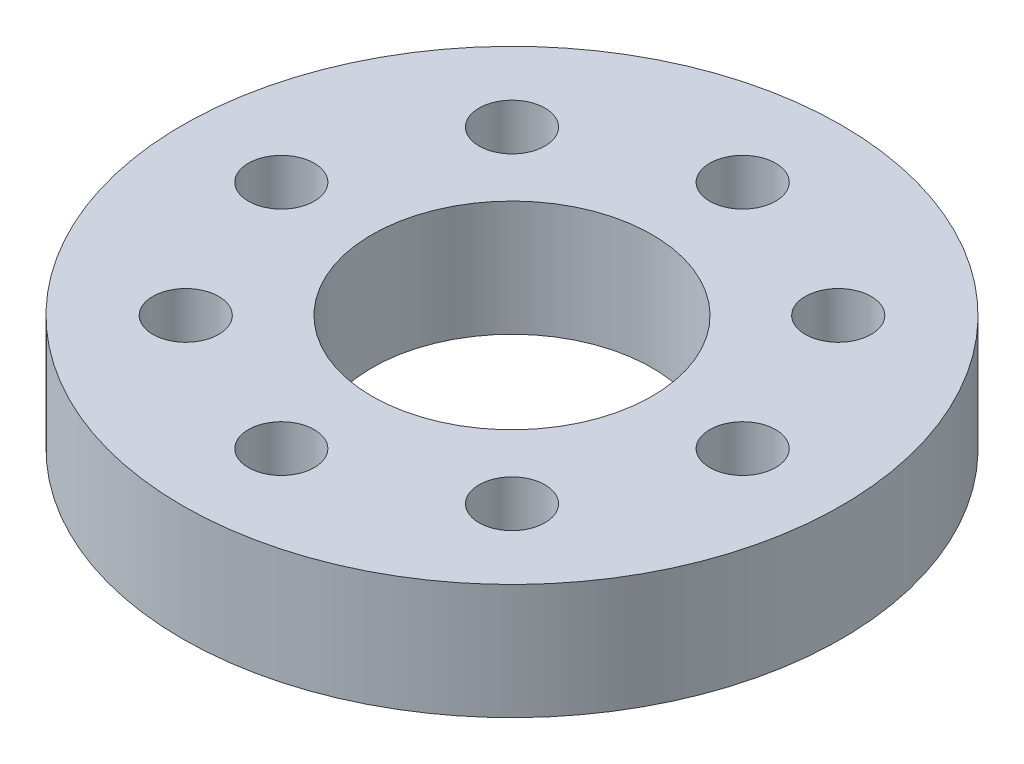
ISO-10303-21;
HEADER;
FILE_DESCRIPTION(('STEP AP214'),'2;1');
FILE_NAME('part.step','',(''),(''),'','','');
FILE_SCHEMA(('AUTOMOTIVE_DESIGN { 1 0 10303 214 1 1 1 1 }'));
ENDSEC;
DATA;
#1=APPLICATION_CONTEXT('core data for automotive mechanical design processes');
#2=APPLICATION_PROTOCOL_DEFINITION('international standard','automotive_design',2000,#1);
#3=PRODUCT_CONTEXT('',#1,'mechanical');
#4=PRODUCT('Part','Part','',(#3));
#5=PRODUCT_RELATED_PRODUCT_CATEGORY('part','',(#4));
#6=PRODUCT_DEFINITION_FORMATION('','',#4);
#7=PRODUCT_DEFINITION_CONTEXT('part definition',#1,'design');
#8=PRODUCT_DEFINITION('design','',#6,#7);
#9=PRODUCT_DEFINITION_SHAPE('','',#8);
#10=(LENGTH_UNIT() NAMED_UNIT(*) SI_UNIT(.MILLI.,.METRE.));
#11=(NAMED_UNIT(*) PLANE_ANGLE_UNIT() SI_UNIT($,.RADIAN.));
#12=(NAMED_UNIT(*) SI_UNIT($,.STERADIAN.) SOLID_ANGLE_UNIT());
#13=UNCERTAINTY_MEASURE_WITH_UNIT(LENGTH_MEASURE(1.E-05),#10,'distance_accuracy_value','');
#14=(GEOMETRIC_REPRESENTATION_CONTEXT(3) GLOBAL_UNCERTAINTY_ASSIGNED_CONTEXT((#13)) GLOBAL_UNIT_ASSIGNED_CONTEXT((#10,
#11,#12)) REPRESENTATION_CONTEXT('',''));
#15=CARTESIAN_POINT('',(0.,0.,0.));
#16=DIRECTION('',(0.,0.,1.));
#17=DIRECTION('',(1.,0.,0.));
#18=AXIS2_PLACEMENT_3D('',#15,#16,#17);
#19=CARTESIAN_POINT('',(0.,3.5,0.));
#20=DIRECTION('',(0.,1.,0.));
#21=DIRECTION('',(0.,0.,1.));
#22=AXIS2_PLACEMENT_3D('',#19,#20,#21);
#23=PLANE('',#22);
#24=CARTESIAN_POINT('',(-6.9999999999994,3.5,5.96855898038484E-13));
#25=DIRECTION('',(0.,1.,0.));
#26=DIRECTION('',(0.,0.,1.));
#27=AXIS2_PLACEMENT_3D('',#24,#25,#26);
#28=CIRCLE('',#27,1.00000000000081);
#29=CARTESIAN_POINT('',(-6.9999999999994,3.5,1.00000000000141));
#30=VERTEX_POINT('',#29);
#31=EDGE_CURVE('E104',#30,#30,#28,.T.);
#32=ORIENTED_EDGE('',*,*,#31,.F.);
#33=EDGE_LOOP('',(#32));
#34=FACE_BOUND('',#33,.T.);
#35=CARTESIAN_POINT('',(1.19170105948276E-12,3.5,7.));
#36=DIRECTION('',(0.,1.,0.));
#37=DIRECTION('',(0.,0.,1.));
#38=AXIS2_PLACEMENT_3D('',#35,#36,#37);
#39=CIRCLE('',#38,1.00000000000119);
#40=CARTESIAN_POINT('',(1.19170105948276E-12,3.5,8.00000000000119));
#41=VERTEX_POINT('',#40);
#42=EDGE_CURVE('E88',#41,#41,#39,.T.);
#43=ORIENTED_EDGE('',*,*,#42,.F.);
#44=EDGE_LOOP('',(#43));
#45=FACE_BOUND('',#44,.T.);
#46=CARTESIAN_POINT('',(7.0000000000006,3.5,-5.95998645279081E-13));
#47=DIRECTION('',(0.,1.,0.));
#48=DIRECTION('',(0.,0.,1.));
#49=AXIS2_PLACEMENT_3D('',#46,#47,#48);
#50=CIRCLE('',#49,1.00000000000042);
#51=CARTESIAN_POINT('',(7.0000000000006,3.5,0.999999999999823));
#52=VERTEX_POINT('',#51);
#53=EDGE_CURVE('E72',#52,#52,#50,.T.);
#54=ORIENTED_EDGE('',*,*,#53,.F.);
#55=EDGE_LOOP('',(#54));
#56=FACE_BOUND('',#55,.T.);
#57=CARTESIAN_POINT('',(0.,3.5,-7.));
#58=DIRECTION('',(0.,1.,0.));
#59=DIRECTION('',(0.,0.,1.));
#60=AXIS2_PLACEMENT_3D('',#57,#58,#59);
#61=CIRCLE('',#60,1.);
#62=CARTESIAN_POINT('',(0.,3.5,-6.));
#63=VERTEX_POINT('',#62);
#64=EDGE_CURVE('E56',#63,#63,#61,.T.);
#65=ORIENTED_EDGE('',*,*,#64,.F.);
#66=EDGE_LOOP('',(#65));
#67=FACE_BOUND('',#66,.T.);
#68=CARTESIAN_POINT('',(0.,3.5,0.));
#69=DIRECTION('',(0.,1.,0.));
#70=DIRECTION('',(0.,0.,1.));
#71=AXIS2_PLACEMENT_3D('',#68,#69,#70);
#72=CIRCLE('',#71,10.);
#73=CARTESIAN_POINT('',(0.,3.5,10.));
#74=VERTEX_POINT('',#73);
#75=EDGE_CURVE('E10',#74,#74,#72,.T.);
#76=ORIENTED_EDGE('',*,*,#75,.T.);
#77=EDGE_LOOP('',(#76));
#78=FACE_BOUND('',#77,.T.);
#79=CARTESIAN_POINT('',(0.,3.5,0.));
#80=DIRECTION('',(0.,1.,0.));
#81=DIRECTION('',(0.,0.,1.));
#82=AXIS2_PLACEMENT_3D('',#79,#80,#81);
#83=CIRCLE('',#82,4.25);
#84=CARTESIAN_POINT('',(0.,3.5,4.25));
#85=VERTEX_POINT('',#84);
#86=EDGE_CURVE('E50',#85,#85,#83,.T.);
#87=ORIENTED_EDGE('',*,*,#86,.F.);
#88=EDGE_LOOP('',(#87));
#89=FACE_BOUND('',#88,.T.);
#90=CARTESIAN_POINT('',(4.94974746830601,3.5,-4.94974746830625));
#91=DIRECTION('',(0.,1.,0.));
#92=DIRECTION('',(0.,0.,1.));
#93=AXIS2_PLACEMENT_3D('',#90,#91,#92);
#94=CIRCLE('',#93,1.00000000000006);
#95=CARTESIAN_POINT('',(4.94974746830601,3.5,-3.9497474683062));
#96=VERTEX_POINT('',#95);
#97=EDGE_CURVE('E64',#96,#96,#94,.T.);
#98=ORIENTED_EDGE('',*,*,#97,.F.);
#99=EDGE_LOOP('',(#98));
#100=FACE_BOUND('',#99,.T.);
#101=CARTESIAN_POINT('',(4.94974746830685,3.5,4.94974746830541));
#102=DIRECTION('',(0.,1.,0.));
#103=DIRECTION('',(0.,0.,1.));
#104=AXIS2_PLACEMENT_3D('',#101,#102,#103);
#105=CIRCLE('',#104,1.00000000000088);
#106=CARTESIAN_POINT('',(4.94974746830685,3.5,5.94974746830629));
#107=VERTEX_POINT('',#106);
#108=EDGE_CURVE('E80',#107,#107,#105,.T.);
#109=ORIENTED_EDGE('',*,*,#108,.F.);
#110=EDGE_LOOP('',(#109));
#111=FACE_BOUND('',#110,.T.);
#112=CARTESIAN_POINT('',(-4.94974746830482,3.5,4.94974746830625));
#113=DIRECTION('',(0.,1.,0.));
#114=DIRECTION('',(0.,0.,1.));
#115=AXIS2_PLACEMENT_3D('',#112,#113,#114);
#116=CIRCLE('',#115,1.00000000000116);
#117=CARTESIAN_POINT('',(-4.94974746830482,3.5,5.94974746830741));
#118=VERTEX_POINT('',#117);
#119=EDGE_CURVE('E96',#118,#118,#116,.T.);
#120=ORIENTED_EDGE('',*,*,#119,.F.);
#121=EDGE_LOOP('',(#120));
#122=FACE_BOUND('',#121,.T.);
#123=CARTESIAN_POINT('',(-4.94974746830566,3.5,-4.94974746830541));
#124=DIRECTION('',(0.,1.,0.));
#125=DIRECTION('',(0.,0.,1.));
#126=AXIS2_PLACEMENT_3D('',#123,#124,#125);
#127=CIRCLE('',#126,1.00000000000037);
#128=CARTESIAN_POINT('',(-4.94974746830566,3.5,-3.94974746830504));
#129=VERTEX_POINT('',#128);
#130=EDGE_CURVE('E112',#129,#129,#127,.T.);
#131=ORIENTED_EDGE('',*,*,#130,.F.);
#132=EDGE_LOOP('',(#131));
#133=FACE_BOUND('',#132,.T.);
#134=ADVANCED_FACE('F37',(#34,#45,#56,#67,#78,#89,#100,#111,#122,#133),#23,.T.);
#135=CARTESIAN_POINT('',(0.,0.,0.));
#136=DIRECTION('',(0.,1.,0.));
#137=DIRECTION('',(0.,0.,1.));
#138=AXIS2_PLACEMENT_3D('',#135,#136,#137);
#139=PLANE('',#138);
#140=CARTESIAN_POINT('',(0.,0.,0.));
#141=DIRECTION('',(0.,1.,0.));
#142=DIRECTION('',(0.,0.,1.));
#143=AXIS2_PLACEMENT_3D('',#140,#141,#142);
#144=CIRCLE('',#143,10.);
#145=CARTESIAN_POINT('',(0.,0.,10.));
#146=VERTEX_POINT('',#145);
#147=EDGE_CURVE('E41',#146,#146,#144,.T.);
#148=ORIENTED_EDGE('',*,*,#147,.F.);
#149=EDGE_LOOP('',(#148));
#150=FACE_BOUND('',#149,.T.);
#151=CARTESIAN_POINT('',(0.,0.,0.));
#152=DIRECTION('',(0.,1.,0.));
#153=DIRECTION('',(0.,0.,1.));
#154=AXIS2_PLACEMENT_3D('',#151,#152,#153);
#155=CIRCLE('',#154,4.25);
#156=CARTESIAN_POINT('',(0.,0.,4.25));
#157=VERTEX_POINT('',#156);
#158=EDGE_CURVE('E52',#157,#157,#155,.T.);
#159=ORIENTED_EDGE('',*,*,#158,.T.);
#160=EDGE_LOOP('',(#159));
#161=FACE_BOUND('',#160,.T.);
#162=CARTESIAN_POINT('',(0.,0.,-7.));
#163=DIRECTION('',(0.,1.,0.));
#164=DIRECTION('',(0.,0.,1.));
#165=AXIS2_PLACEMENT_3D('',#162,#163,#164);
#166=CIRCLE('',#165,1.);
#167=CARTESIAN_POINT('',(0.,0.,-6.));
#168=VERTEX_POINT('',#167);
#169=EDGE_CURVE('E60',#168,#168,#166,.T.);
#170=ORIENTED_EDGE('',*,*,#169,.T.);
#171=EDGE_LOOP('',(#170));
#172=FACE_BOUND('',#171,.T.);
#173=CARTESIAN_POINT('',(4.94974746830601,0.,-4.94974746830625));
#174=DIRECTION('',(0.,1.,0.));
#175=DIRECTION('',(0.,0.,1.));
#176=AXIS2_PLACEMENT_3D('',#173,#174,#175);
#177=CIRCLE('',#176,1.00000000000006);
#178=CARTESIAN_POINT('',(4.94974746830601,0.,-3.9497474683062));
#179=VERTEX_POINT('',#178);
#180=EDGE_CURVE('E68',#179,#179,#177,.T.);
#181=ORIENTED_EDGE('',*,*,#180,.T.);
#182=EDGE_LOOP('',(#181));
#183=FACE_BOUND('',#182,.T.);
#184=CARTESIAN_POINT('',(7.0000000000006,0.,-5.95998645279081E-13));
#185=DIRECTION('',(0.,1.,0.));
#186=DIRECTION('',(0.,0.,1.));
#187=AXIS2_PLACEMENT_3D('',#184,#185,#186);
#188=CIRCLE('',#187,1.00000000000042);
#189=CARTESIAN_POINT('',(7.0000000000006,0.,0.999999999999823));
#190=VERTEX_POINT('',#189);
#191=EDGE_CURVE('E76',#190,#190,#188,.T.);
#192=ORIENTED_EDGE('',*,*,#191,.T.);
#193=EDGE_LOOP('',(#192));
#194=FACE_BOUND('',#193,.T.);
#195=CARTESIAN_POINT('',(4.94974746830685,0.,4.94974746830541));
#196=DIRECTION('',(0.,1.,0.));
#197=DIRECTION('',(0.,0.,1.));
#198=AXIS2_PLACEMENT_3D('',#195,#196,#197);
#199=CIRCLE('',#198,1.00000000000088);
#200=CARTESIAN_POINT('',(4.94974746830685,0.,5.94974746830629));
#201=VERTEX_POINT('',#200);
#202=EDGE_CURVE('E84',#201,#201,#199,.T.);
#203=ORIENTED_EDGE('',*,*,#202,.T.);
#204=EDGE_LOOP('',(#203));
#205=FACE_BOUND('',#204,.T.);
#206=CARTESIAN_POINT('',(1.19170105948276E-12,0.,7.));
#207=DIRECTION('',(0.,1.,0.));
#208=DIRECTION('',(0.,0.,1.));
#209=AXIS2_PLACEMENT_3D('',#206,#207,#208);
#210=CIRCLE('',#209,1.00000000000119);
#211=CARTESIAN_POINT('',(1.19170105948276E-12,0.,8.00000000000119));
#212=VERTEX_POINT('',#211);
#213=EDGE_CURVE('E92',#212,#212,#210,.T.);
#214=ORIENTED_EDGE('',*,*,#213,.T.);
#215=EDGE_LOOP('',(#214));
#216=FACE_BOUND('',#215,.T.);
#217=CARTESIAN_POINT('',(-4.94974746830482,0.,4.94974746830625));
#218=DIRECTION('',(0.,1.,0.));
#219=DIRECTION('',(0.,0.,1.));
#220=AXIS2_PLACEMENT_3D('',#217,#218,#219);
#221=CIRCLE('',#220,1.00000000000116);
#222=CARTESIAN_POINT('',(-4.94974746830482,0.,5.94974746830741));
#223=VERTEX_POINT('',#222);
#224=EDGE_CURVE('E100',#223,#223,#221,.T.);
#225=ORIENTED_EDGE('',*,*,#224,.T.);
#226=EDGE_LOOP('',(#225));
#227=FACE_BOUND('',#226,.T.);
#228=CARTESIAN_POINT('',(-6.9999999999994,0.,5.96855898038484E-13));
#229=DIRECTION('',(0.,1.,0.));
#230=DIRECTION('',(0.,0.,1.));
#231=AXIS2_PLACEMENT_3D('',#228,#229,#230);
#232=CIRCLE('',#231,1.00000000000081);
#233=CARTESIAN_POINT('',(-6.9999999999994,0.,1.00000000000141));
#234=VERTEX_POINT('',#233);
#235=EDGE_CURVE('E108',#234,#234,#232,.T.);
#236=ORIENTED_EDGE('',*,*,#235,.T.);
#237=EDGE_LOOP('',(#236));
#238=FACE_BOUND('',#237,.T.);
#239=CARTESIAN_POINT('',(-4.94974746830566,0.,-4.94974746830541));
#240=DIRECTION('',(0.,1.,0.));
#241=DIRECTION('',(0.,0.,1.));
#242=AXIS2_PLACEMENT_3D('',#239,#240,#241);
#243=CIRCLE('',#242,1.00000000000037);
#244=CARTESIAN_POINT('',(-4.94974746830566,0.,-3.94974746830504));
#245=VERTEX_POINT('',#244);
#246=EDGE_CURVE('E116',#245,#245,#243,.T.);
#247=ORIENTED_EDGE('',*,*,#246,.T.);
#248=EDGE_LOOP('',(#247));
#249=FACE_BOUND('',#248,.T.);
#250=ADVANCED_FACE('F128',(#150,#161,#172,#183,#194,#205,#216,#227,#238,#249),#139,.F.);
#251=CARTESIAN_POINT('',(0.,3.5,0.));
#252=DIRECTION('',(0.,-1.,0.));
#253=DIRECTION('',(0.,0.,-1.));
#254=AXIS2_PLACEMENT_3D('',#251,#252,#253);
#255=CYLINDRICAL_SURFACE('',#254,10.);
#256=ORIENTED_EDGE('',*,*,#75,.F.);
#257=EDGE_LOOP('',(#256));
#258=FACE_BOUND('',#257,.T.);
#259=ORIENTED_EDGE('',*,*,#147,.T.);
#260=EDGE_LOOP('',(#259));
#261=FACE_BOUND('',#260,.T.);
#262=ADVANCED_FACE('F39',(#258,#261),#255,.T.);
#263=CARTESIAN_POINT('',(0.,3.5,0.));
#264=DIRECTION('',(0.,-1.,0.));
#265=DIRECTION('',(0.,0.,-1.));
#266=AXIS2_PLACEMENT_3D('',#263,#264,#265);
#267=CYLINDRICAL_SURFACE('',#266,4.25);
#268=ORIENTED_EDGE('',*,*,#86,.T.);
#269=EDGE_LOOP('',(#268));
#270=FACE_BOUND('',#269,.T.);
#271=ORIENTED_EDGE('',*,*,#158,.F.);
#272=EDGE_LOOP('',(#271));
#273=FACE_BOUND('',#272,.T.);
#274=ADVANCED_FACE('F138',(#270,#273),#267,.F.);
#275=CARTESIAN_POINT('',(0.,3.5,-7.));
#276=DIRECTION('',(0.,-1.,0.));
#277=DIRECTION('',(0.,0.,-1.));
#278=AXIS2_PLACEMENT_3D('',#275,#276,#277);
#279=CYLINDRICAL_SURFACE('',#278,1.);
#280=ORIENTED_EDGE('',*,*,#64,.T.);
#281=EDGE_LOOP('',(#280));
#282=FACE_BOUND('',#281,.T.);
#283=ORIENTED_EDGE('',*,*,#169,.F.);
#284=EDGE_LOOP('',(#283));
#285=FACE_BOUND('',#284,.T.);
#286=ADVANCED_FACE('F141',(#282,#285),#279,.F.);
#287=CARTESIAN_POINT('',(4.94974746830601,3.5,-4.94974746830625));
#288=DIRECTION('',(0.,-1.,0.));
#289=DIRECTION('',(0.,0.,-1.));
#290=AXIS2_PLACEMENT_3D('',#287,#288,#289);
#291=CYLINDRICAL_SURFACE('',#290,1.00000000000006);
#292=ORIENTED_EDGE('',*,*,#97,.T.);
#293=EDGE_LOOP('',(#292));
#294=FACE_BOUND('',#293,.T.);
#295=ORIENTED_EDGE('',*,*,#180,.F.);
#296=EDGE_LOOP('',(#295));
#297=FACE_BOUND('',#296,.T.);
#298=ADVANCED_FACE('F145',(#294,#297),#291,.F.);
#299=CARTESIAN_POINT('',(7.0000000000006,3.5,-5.95998645279081E-13));
#300=DIRECTION('',(0.,-1.,0.));
#301=DIRECTION('',(0.,0.,-1.));
#302=AXIS2_PLACEMENT_3D('',#299,#300,#301);
#303=CYLINDRICAL_SURFACE('',#302,1.00000000000042);
#304=ORIENTED_EDGE('',*,*,#53,.T.);
#305=EDGE_LOOP('',(#304));
#306=FACE_BOUND('',#305,.T.);
#307=ORIENTED_EDGE('',*,*,#191,.F.);
#308=EDGE_LOOP('',(#307));
#309=FACE_BOUND('',#308,.T.);
#310=ADVANCED_FACE('F149',(#306,#309),#303,.F.);
#311=CARTESIAN_POINT('',(4.94974746830685,3.5,4.94974746830541));
#312=DIRECTION('',(0.,-1.,0.));
#313=DIRECTION('',(0.,0.,-1.));
#314=AXIS2_PLACEMENT_3D('',#311,#312,#313);
#315=CYLINDRICAL_SURFACE('',#314,1.00000000000088);
#316=ORIENTED_EDGE('',*,*,#108,.T.);
#317=EDGE_LOOP('',(#316));
#318=FACE_BOUND('',#317,.T.);
#319=ORIENTED_EDGE('',*,*,#202,.F.);
#320=EDGE_LOOP('',(#319));
#321=FACE_BOUND('',#320,.T.);
#322=ADVANCED_FACE('F153',(#318,#321),#315,.F.);
#323=CARTESIAN_POINT('',(1.19170105948276E-12,3.5,7.));
#324=DIRECTION('',(0.,-1.,0.));
#325=DIRECTION('',(0.,0.,-1.));
#326=AXIS2_PLACEMENT_3D('',#323,#324,#325);
#327=CYLINDRICAL_SURFACE('',#326,1.00000000000119);
#328=ORIENTED_EDGE('',*,*,#42,.T.);
#329=EDGE_LOOP('',(#328));
#330=FACE_BOUND('',#329,.T.);
#331=ORIENTED_EDGE('',*,*,#213,.F.);
#332=EDGE_LOOP('',(#331));
#333=FACE_BOUND('',#332,.T.);
#334=ADVANCED_FACE('F157',(#330,#333),#327,.F.);
#335=CARTESIAN_POINT('',(-4.94974746830482,3.5,4.94974746830625));
#336=DIRECTION('',(0.,-1.,0.));
#337=DIRECTION('',(0.,0.,-1.));
#338=AXIS2_PLACEMENT_3D('',#335,#336,#337);
#339=CYLINDRICAL_SURFACE('',#338,1.00000000000116);
#340=ORIENTED_EDGE('',*,*,#119,.T.);
#341=EDGE_LOOP('',(#340));
#342=FACE_BOUND('',#341,.T.);
#343=ORIENTED_EDGE('',*,*,#224,.F.);
#344=EDGE_LOOP('',(#343));
#345=FACE_BOUND('',#344,.T.);
#346=ADVANCED_FACE('F161',(#342,#345),#339,.F.);
#347=CARTESIAN_POINT('',(-6.9999999999994,3.5,5.96855898038484E-13));
#348=DIRECTION('',(0.,-1.,0.));
#349=DIRECTION('',(0.,0.,-1.));
#350=AXIS2_PLACEMENT_3D('',#347,#348,#349);
#351=CYLINDRICAL_SURFACE('',#350,1.00000000000081);
#352=ORIENTED_EDGE('',*,*,#31,.T.);
#353=EDGE_LOOP('',(#352));
#354=FACE_BOUND('',#353,.T.);
#355=ORIENTED_EDGE('',*,*,#235,.F.);
#356=EDGE_LOOP('',(#355));
#357=FACE_BOUND('',#356,.T.);
#358=ADVANCED_FACE('F165',(#354,#357),#351,.F.);
#359=CARTESIAN_POINT('',(-4.94974746830566,3.5,-4.94974746830541));
#360=DIRECTION('',(0.,-1.,0.));
#361=DIRECTION('',(0.,0.,-1.));
#362=AXIS2_PLACEMENT_3D('',#359,#360,#361);
#363=CYLINDRICAL_SURFACE('',#362,1.00000000000037);
#364=ORIENTED_EDGE('',*,*,#130,.T.);
#365=EDGE_LOOP('',(#364));
#366=FACE_BOUND('',#365,.T.);
#367=ORIENTED_EDGE('',*,*,#246,.F.);
#368=EDGE_LOOP('',(#367));
#369=FACE_BOUND('',#368,.T.);
#370=ADVANCED_FACE('F124',(#366,#369),#363,.F.);
#371=CLOSED_SHELL('',(#134,#250,#262,#274,#286,#298,#310,#322,#334,#346,#358,#370));
#372=MANIFOLD_SOLID_BREP('B2',#371);
#373=ADVANCED_BREP_SHAPE_REPRESENTATION('',(#18,#372),#14);
#374=SHAPE_DEFINITION_REPRESENTATION(#9,#373);
ENDSEC;
END-ISO-10303-21;
